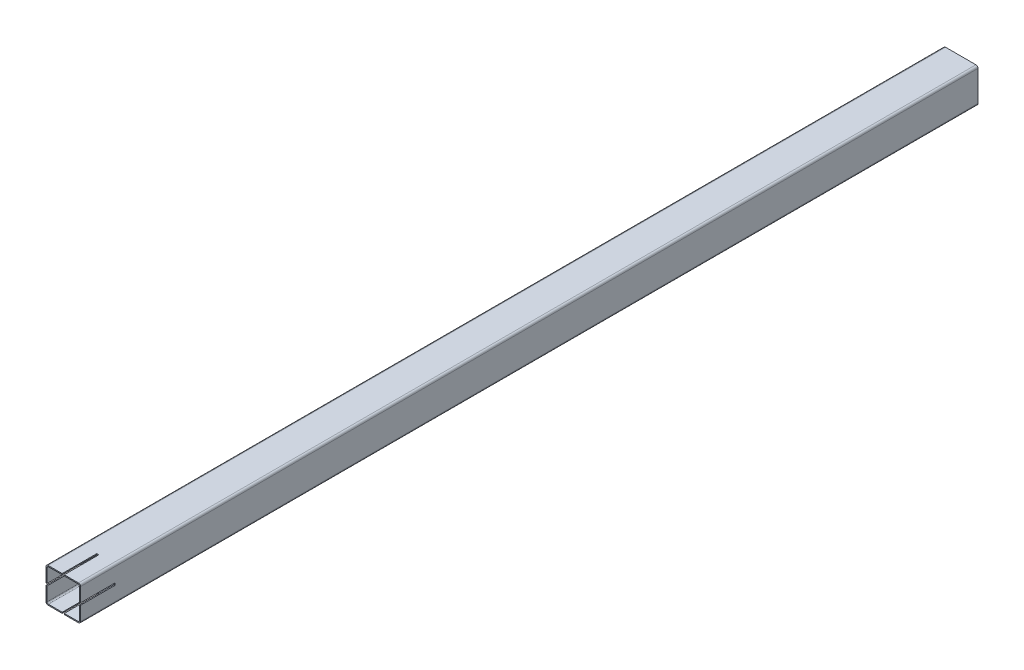
ISO-10303-21;
HEADER;
FILE_DESCRIPTION(('STEP AP214'),'2;1');
FILE_NAME('part.step','',(''),(''),'','','');
FILE_SCHEMA(('AUTOMOTIVE_DESIGN { 1 0 10303 214 1 1 1 1 }'));
ENDSEC;
DATA;
#1=APPLICATION_CONTEXT('core data for automotive mechanical design processes');
#2=APPLICATION_PROTOCOL_DEFINITION('international standard','automotive_design',2000,#1);
#3=PRODUCT_CONTEXT('',#1,'mechanical');
#4=PRODUCT('Part','Part','',(#3));
#5=PRODUCT_RELATED_PRODUCT_CATEGORY('part','',(#4));
#6=PRODUCT_DEFINITION_FORMATION('','',#4);
#7=PRODUCT_DEFINITION_CONTEXT('part definition',#1,'design');
#8=PRODUCT_DEFINITION('design','',#6,#7);
#9=PRODUCT_DEFINITION_SHAPE('','',#8);
#10=(LENGTH_UNIT() NAMED_UNIT(*) SI_UNIT(.MILLI.,.METRE.));
#11=(NAMED_UNIT(*) PLANE_ANGLE_UNIT() SI_UNIT($,.RADIAN.));
#12=(NAMED_UNIT(*) SI_UNIT($,.STERADIAN.) SOLID_ANGLE_UNIT());
#13=UNCERTAINTY_MEASURE_WITH_UNIT(LENGTH_MEASURE(1.E-05),#10,'distance_accuracy_value','');
#14=(GEOMETRIC_REPRESENTATION_CONTEXT(3) GLOBAL_UNCERTAINTY_ASSIGNED_CONTEXT((#13)) GLOBAL_UNIT_ASSIGNED_CONTEXT((#10,
#11,#12)) REPRESENTATION_CONTEXT('',''));
#15=CARTESIAN_POINT('',(0.,0.,0.));
#16=DIRECTION('',(0.,0.,1.));
#17=DIRECTION('',(1.,0.,0.));
#18=AXIS2_PLACEMENT_3D('',#15,#16,#17);
#19=CARTESIAN_POINT('',(-44.0000000000005,-43.9999999999965,0.));
#20=DIRECTION('',(0.,0.,1.));
#21=DIRECTION('',(1.,0.,0.));
#22=AXIS2_PLACEMENT_3D('',#19,#20,#21);
#23=PLANE('',#22);
#24=DIRECTION('',(-1.,0.,0.));
#25=VECTOR('',#24,1.);
#26=CARTESIAN_POINT('',(-50.0000000000007,3.,0.));
#27=LINE('',#26,#25);
#28=CARTESIAN_POINT('',(-47.0000000000009,3.,0.));
#29=VERTEX_POINT('',#28);
#30=CARTESIAN_POINT('',(-50.0000000000007,3.,0.));
#31=VERTEX_POINT('',#30);
#32=EDGE_CURVE('E259',#29,#31,#27,.T.);
#33=ORIENTED_EDGE('',*,*,#32,.F.);
#34=DIRECTION('',(0.,-1.,0.));
#35=VECTOR('',#34,1.);
#36=CARTESIAN_POINT('',(-47.0000000000009,43.0000000000035,0.));
#37=LINE('',#36,#35);
#38=CARTESIAN_POINT('',(-47.0000000000009,43.0000000000035,0.));
#39=VERTEX_POINT('',#38);
#40=EDGE_CURVE('E285',#39,#29,#37,.T.);
#41=ORIENTED_EDGE('',*,*,#40,.F.);
#42=CARTESIAN_POINT('',(-43.0000000000009,43.0000000000035,0.));
#43=DIRECTION('',(0.,0.,1.));
#44=DIRECTION('',(1.,0.,0.));
#45=AXIS2_PLACEMENT_3D('',#42,#43,#44);
#46=CIRCLE('',#45,4.);
#47=CARTESIAN_POINT('',(-43.0000000000009,47.0000000000035,0.));
#48=VERTEX_POINT('',#47);
#49=EDGE_CURVE('E326',#48,#39,#46,.T.);
#50=ORIENTED_EDGE('',*,*,#49,.F.);
#51=DIRECTION('',(-1.,0.,0.));
#52=VECTOR('',#51,1.);
#53=CARTESIAN_POINT('',(-43.0000000000009,47.0000000000035,0.));
#54=LINE('',#53,#52);
#55=CARTESIAN_POINT('',(-3.00000000000001,47.0000000000035,0.));
#56=VERTEX_POINT('',#55);
#57=EDGE_CURVE('E322',#56,#48,#54,.T.);
#58=ORIENTED_EDGE('',*,*,#57,.F.);
#59=DIRECTION('',(0.,-1.,0.));
#60=VECTOR('',#59,1.);
#61=CARTESIAN_POINT('',(-3.00000000000001,50.0000000000035,0.));
#62=LINE('',#61,#60);
#63=CARTESIAN_POINT('',(-3.00000000000001,50.0000000000035,0.));
#64=VERTEX_POINT('',#63);
#65=EDGE_CURVE('E472',#64,#56,#62,.T.);
#66=ORIENTED_EDGE('',*,*,#65,.F.);
#67=DIRECTION('',(-1.,0.,0.));
#68=VECTOR('',#67,1.);
#69=CARTESIAN_POINT('',(-44.0000000000005,50.0000000000035,0.));
#70=LINE('',#69,#68);
#71=CARTESIAN_POINT('',(-44.0000000000005,50.0000000000036,0.));
#72=VERTEX_POINT('',#71);
#73=EDGE_CURVE('E395',#64,#72,#70,.T.);
#74=ORIENTED_EDGE('',*,*,#73,.T.);
#75=CARTESIAN_POINT('',(-44.0000000000005,44.0000000000034,0.));
#76=DIRECTION('',(0.,0.,1.));
#77=DIRECTION('',(1.,0.,0.));
#78=AXIS2_PLACEMENT_3D('',#75,#76,#77);
#79=CIRCLE('',#78,6.00000000000014);
#80=CARTESIAN_POINT('',(-50.0000000000007,44.0000000000034,0.));
#81=VERTEX_POINT('',#80);
#82=EDGE_CURVE('E399',#72,#81,#79,.T.);
#83=ORIENTED_EDGE('',*,*,#82,.T.);
#84=DIRECTION('',(0.,-1.,0.));
#85=VECTOR('',#84,1.);
#86=CARTESIAN_POINT('',(-50.0000000000007,44.0000000000034,0.));
#87=LINE('',#86,#85);
#88=EDGE_CURVE('E357',#81,#31,#87,.T.);
#89=ORIENTED_EDGE('',*,*,#88,.T.);
#90=EDGE_LOOP('',(#33,#41,#50,#58,#66,#74,#83,#89));
#91=FACE_BOUND('',#90,.T.);
#92=ADVANCED_FACE('F36',(#91),#23,.T.);
#93=DIRECTION('',(0.,1.,0.));
#94=VECTOR('',#93,1.);
#95=CARTESIAN_POINT('',(3.00000000000001,50.0000000000035,0.));
#96=LINE('',#95,#94);
#97=CARTESIAN_POINT('',(3.00000000000001,47.0000000000035,0.));
#98=VERTEX_POINT('',#97);
#99=CARTESIAN_POINT('',(3.00000000000001,50.0000000000035,0.));
#100=VERTEX_POINT('',#99);
#101=EDGE_CURVE('E474',#98,#100,#96,.T.);
#102=ORIENTED_EDGE('',*,*,#101,.F.);
#103=CARTESIAN_POINT('',(42.9999999999991,47.0000000000035,0.));
#104=VERTEX_POINT('',#103);
#105=EDGE_CURVE('E323',#104,#98,#54,.T.);
#106=ORIENTED_EDGE('',*,*,#105,.F.);
#107=CARTESIAN_POINT('',(42.9999999999991,43.0000000000035,0.));
#108=DIRECTION('',(0.,0.,1.));
#109=DIRECTION('',(-1.,0.,0.));
#110=AXIS2_PLACEMENT_3D('',#107,#108,#109);
#111=CIRCLE('',#110,4.);
#112=CARTESIAN_POINT('',(46.9999999999991,43.0000000000035,0.));
#113=VERTEX_POINT('',#112);
#114=EDGE_CURVE('E319',#113,#104,#111,.T.);
#115=ORIENTED_EDGE('',*,*,#114,.F.);
#116=DIRECTION('',(0.,1.,0.));
#117=VECTOR('',#116,1.);
#118=CARTESIAN_POINT('',(46.9999999999991,43.0000000000035,0.));
#119=LINE('',#118,#117);
#120=CARTESIAN_POINT('',(46.9999999999991,3.,0.));
#121=VERTEX_POINT('',#120);
#122=EDGE_CURVE('E315',#121,#113,#119,.T.);
#123=ORIENTED_EDGE('',*,*,#122,.F.);
#124=DIRECTION('',(-1.,0.,0.));
#125=VECTOR('',#124,1.);
#126=CARTESIAN_POINT('',(3.,3.,0.));
#127=LINE('',#126,#125);
#128=CARTESIAN_POINT('',(49.9999999999989,3.,0.));
#129=VERTEX_POINT('',#128);
#130=EDGE_CURVE('E527',#129,#121,#127,.T.);
#131=ORIENTED_EDGE('',*,*,#130,.F.);
#132=DIRECTION('',(0.,1.,0.));
#133=VECTOR('',#132,1.);
#134=CARTESIAN_POINT('',(49.9999999999989,44.0000000000034,0.));
#135=LINE('',#134,#133);
#136=CARTESIAN_POINT('',(49.9999999999988,44.0000000000034,0.));
#137=VERTEX_POINT('',#136);
#138=EDGE_CURVE('E388',#129,#137,#135,.T.);
#139=ORIENTED_EDGE('',*,*,#138,.T.);
#140=CARTESIAN_POINT('',(43.9999999999987,44.0000000000034,0.));
#141=DIRECTION('',(0.,0.,1.));
#142=DIRECTION('',(-1.,0.,0.));
#143=AXIS2_PLACEMENT_3D('',#140,#141,#142);
#144=CIRCLE('',#143,6.00000000000014);
#145=CARTESIAN_POINT('',(43.9999999999987,50.0000000000035,0.));
#146=VERTEX_POINT('',#145);
#147=EDGE_CURVE('E392',#137,#146,#144,.T.);
#148=ORIENTED_EDGE('',*,*,#147,.T.);
#149=EDGE_CURVE('E396',#146,#100,#70,.T.);
#150=ORIENTED_EDGE('',*,*,#149,.T.);
#151=EDGE_LOOP('',(#102,#106,#115,#123,#131,#139,#148,#150));
#152=FACE_BOUND('',#151,.T.);
#153=ADVANCED_FACE('F544',(#152),#23,.T.);
#154=DIRECTION('',(1.,0.,0.));
#155=VECTOR('',#154,1.);
#156=CARTESIAN_POINT('',(3.,-3.,0.));
#157=LINE('',#156,#155);
#158=CARTESIAN_POINT('',(46.9999999999991,-3.,0.));
#159=VERTEX_POINT('',#158);
#160=CARTESIAN_POINT('',(49.9999999999989,-3.,0.));
#161=VERTEX_POINT('',#160);
#162=EDGE_CURVE('E504',#159,#161,#157,.T.);
#163=ORIENTED_EDGE('',*,*,#162,.F.);
#164=CARTESIAN_POINT('',(46.9999999999991,-42.9999999999966,0.));
#165=VERTEX_POINT('',#164);
#166=EDGE_CURVE('E316',#165,#159,#119,.T.);
#167=ORIENTED_EDGE('',*,*,#166,.F.);
#168=CARTESIAN_POINT('',(42.9999999999991,-42.9999999999966,0.));
#169=DIRECTION('',(0.,0.,1.));
#170=DIRECTION('',(1.,0.,0.));
#171=AXIS2_PLACEMENT_3D('',#168,#169,#170);
#172=CIRCLE('',#171,4.);
#173=CARTESIAN_POINT('',(42.9999999999991,-46.9999999999966,0.));
#174=VERTEX_POINT('',#173);
#175=EDGE_CURVE('E312',#174,#165,#172,.T.);
#176=ORIENTED_EDGE('',*,*,#175,.F.);
#177=DIRECTION('',(1.,0.,0.));
#178=VECTOR('',#177,1.);
#179=CARTESIAN_POINT('',(-43.0000000000009,-46.9999999999966,0.));
#180=LINE('',#179,#178);
#181=CARTESIAN_POINT('',(3.,-46.9999999999966,0.));
#182=VERTEX_POINT('',#181);
#183=EDGE_CURVE('E308',#182,#174,#180,.T.);
#184=ORIENTED_EDGE('',*,*,#183,.F.);
#185=DIRECTION('',(0.,1.,0.));
#186=VECTOR('',#185,1.);
#187=CARTESIAN_POINT('',(3.,-3.,0.));
#188=LINE('',#187,#186);
#189=CARTESIAN_POINT('',(3.,-49.9999999999966,0.));
#190=VERTEX_POINT('',#189);
#191=EDGE_CURVE('E493',#190,#182,#188,.T.);
#192=ORIENTED_EDGE('',*,*,#191,.F.);
#193=DIRECTION('',(1.,0.,0.));
#194=VECTOR('',#193,1.);
#195=CARTESIAN_POINT('',(-44.0000000000005,-49.9999999999966,0.));
#196=LINE('',#195,#194);
#197=CARTESIAN_POINT('',(43.9999999999987,-49.9999999999967,0.));
#198=VERTEX_POINT('',#197);
#199=EDGE_CURVE('E381',#190,#198,#196,.T.);
#200=ORIENTED_EDGE('',*,*,#199,.T.);
#201=CARTESIAN_POINT('',(43.9999999999987,-43.9999999999965,0.));
#202=DIRECTION('',(0.,0.,1.));
#203=DIRECTION('',(1.,0.,0.));
#204=AXIS2_PLACEMENT_3D('',#201,#202,#203);
#205=CIRCLE('',#204,6.00000000000014);
#206=CARTESIAN_POINT('',(49.9999999999989,-43.9999999999965,0.));
#207=VERTEX_POINT('',#206);
#208=EDGE_CURVE('E385',#198,#207,#205,.T.);
#209=ORIENTED_EDGE('',*,*,#208,.T.);
#210=EDGE_CURVE('E389',#207,#161,#135,.T.);
#211=ORIENTED_EDGE('',*,*,#210,.T.);
#212=EDGE_LOOP('',(#163,#167,#176,#184,#192,#200,#209,#211));
#213=FACE_BOUND('',#212,.T.);
#214=ADVANCED_FACE('F502',(#213),#23,.T.);
#215=CARTESIAN_POINT('',(-44.0000000000005,-43.9999999999965,-2600.));
#216=DIRECTION('',(0.,0.,1.));
#217=DIRECTION('',(1.,0.,0.));
#218=AXIS2_PLACEMENT_3D('',#215,#216,#217);
#219=CYLINDRICAL_SURFACE('',#218,6.00000000000014);
#220=CARTESIAN_POINT('',(-44.0000000000005,-43.9999999999965,0.));
#221=DIRECTION('',(0.,0.,1.));
#222=DIRECTION('',(1.,0.,0.));
#223=AXIS2_PLACEMENT_3D('',#220,#221,#222);
#224=CIRCLE('',#223,6.00000000000014);
#225=CARTESIAN_POINT('',(-50.0000000000007,-43.9999999999965,0.));
#226=VERTEX_POINT('',#225);
#227=CARTESIAN_POINT('',(-44.0000000000005,-49.9999999999966,0.));
#228=VERTEX_POINT('',#227);
#229=EDGE_CURVE('E335',#226,#228,#224,.T.);
#230=ORIENTED_EDGE('',*,*,#229,.F.);
#231=DIRECTION('',(0.,0.,1.));
#232=VECTOR('',#231,1.);
#233=CARTESIAN_POINT('',(-50.0000000000007,-43.9999999999965,-2600.));
#234=LINE('',#233,#232);
#235=CARTESIAN_POINT('',(-50.0000000000007,-43.9999999999965,-2600.));
#236=VERTEX_POINT('',#235);
#237=EDGE_CURVE('E404',#236,#226,#234,.T.);
#238=ORIENTED_EDGE('',*,*,#237,.F.);
#239=CARTESIAN_POINT('',(-44.0000000000005,-43.9999999999965,-2600.));
#240=DIRECTION('',(0.,0.,1.));
#241=DIRECTION('',(1.,0.,0.));
#242=AXIS2_PLACEMENT_3D('',#239,#240,#241);
#243=CIRCLE('',#242,6.00000000000014);
#244=CARTESIAN_POINT('',(-44.0000000000005,-49.9999999999966,-2600.));
#245=VERTEX_POINT('',#244);
#246=EDGE_CURVE('E353',#236,#245,#243,.T.);
#247=ORIENTED_EDGE('',*,*,#246,.T.);
#248=DIRECTION('',(0.,0.,1.));
#249=VECTOR('',#248,1.);
#250=CARTESIAN_POINT('',(-44.0000000000005,-49.9999999999966,-2600.));
#251=LINE('',#250,#249);
#252=EDGE_CURVE('E378',#245,#228,#251,.T.);
#253=ORIENTED_EDGE('',*,*,#252,.T.);
#254=EDGE_LOOP('',(#230,#238,#247,#253));
#255=FACE_BOUND('',#254,.T.);
#256=ADVANCED_FACE('F38',(#255),#219,.T.);
#257=CARTESIAN_POINT('',(-50.0000000000007,44.0000000000034,-2600.));
#258=DIRECTION('',(-1.,0.,0.));
#259=DIRECTION('',(0.,0.,1.));
#260=AXIS2_PLACEMENT_3D('',#257,#258,#259);
#261=PLANE('',#260);
#262=DIRECTION('',(0.,0.,1.));
#263=VECTOR('',#262,1.);
#264=CARTESIAN_POINT('',(-50.0000000000007,3.,-100.));
#265=LINE('',#264,#263);
#266=CARTESIAN_POINT('',(-50.0000000000007,3.,-100.));
#267=VERTEX_POINT('',#266);
#268=EDGE_CURVE('E276',#267,#31,#265,.T.);
#269=ORIENTED_EDGE('',*,*,#268,.T.);
#270=ORIENTED_EDGE('',*,*,#88,.F.);
#271=DIRECTION('',(0.,0.,1.));
#272=VECTOR('',#271,1.);
#273=CARTESIAN_POINT('',(-50.0000000000007,44.0000000000034,-2600.));
#274=LINE('',#273,#272);
#275=CARTESIAN_POINT('',(-50.0000000000007,44.0000000000034,-2600.));
#276=VERTEX_POINT('',#275);
#277=EDGE_CURVE('E407',#276,#81,#274,.T.);
#278=ORIENTED_EDGE('',*,*,#277,.F.);
#279=DIRECTION('',(0.,-1.,0.));
#280=VECTOR('',#279,1.);
#281=CARTESIAN_POINT('',(-50.0000000000007,44.0000000000034,-2600.));
#282=LINE('',#281,#280);
#283=EDGE_CURVE('E375',#276,#236,#282,.T.);
#284=ORIENTED_EDGE('',*,*,#283,.T.);
#285=ORIENTED_EDGE('',*,*,#237,.T.);
#286=CARTESIAN_POINT('',(-50.0000000000007,-3.,0.));
#287=VERTEX_POINT('',#286);
#288=EDGE_CURVE('E264',#287,#226,#87,.T.);
#289=ORIENTED_EDGE('',*,*,#288,.F.);
#290=DIRECTION('',(0.,0.,1.));
#291=VECTOR('',#290,1.);
#292=CARTESIAN_POINT('',(-50.0000000000007,-3.,-100.));
#293=LINE('',#292,#291);
#294=CARTESIAN_POINT('',(-50.0000000000007,-3.,-100.));
#295=VERTEX_POINT('',#294);
#296=EDGE_CURVE('E245',#295,#287,#293,.T.);
#297=ORIENTED_EDGE('',*,*,#296,.F.);
#298=DIRECTION('',(0.,-1.,0.));
#299=VECTOR('',#298,1.);
#300=CARTESIAN_POINT('',(-50.0000000000007,3.,-100.));
#301=LINE('',#300,#299);
#302=EDGE_CURVE('E250',#267,#295,#301,.T.);
#303=ORIENTED_EDGE('',*,*,#302,.F.);
#304=EDGE_LOOP('',(#269,#270,#278,#284,#285,#289,#297,#303));
#305=FACE_BOUND('',#304,.T.);
#306=ADVANCED_FACE('F262',(#305),#261,.T.);
#307=CARTESIAN_POINT('',(-44.0000000000005,44.0000000000034,-2600.));
#308=DIRECTION('',(0.,0.,1.));
#309=DIRECTION('',(1.,0.,0.));
#310=AXIS2_PLACEMENT_3D('',#307,#308,#309);
#311=CYLINDRICAL_SURFACE('',#310,6.00000000000014);
#312=ORIENTED_EDGE('',*,*,#82,.F.);
#313=DIRECTION('',(0.,0.,1.));
#314=VECTOR('',#313,1.);
#315=CARTESIAN_POINT('',(-44.0000000000005,50.0000000000036,-2600.));
#316=LINE('',#315,#314);
#317=CARTESIAN_POINT('',(-44.0000000000005,50.0000000000036,-2600.));
#318=VERTEX_POINT('',#317);
#319=EDGE_CURVE('E409',#318,#72,#316,.T.);
#320=ORIENTED_EDGE('',*,*,#319,.F.);
#321=CARTESIAN_POINT('',(-44.0000000000005,44.0000000000034,-2600.));
#322=DIRECTION('',(0.,0.,1.));
#323=DIRECTION('',(1.,0.,0.));
#324=AXIS2_PLACEMENT_3D('',#321,#322,#323);
#325=CIRCLE('',#324,6.00000000000014);
#326=EDGE_CURVE('E372',#318,#276,#325,.T.);
#327=ORIENTED_EDGE('',*,*,#326,.T.);
#328=ORIENTED_EDGE('',*,*,#277,.T.);
#329=EDGE_LOOP('',(#312,#320,#327,#328));
#330=FACE_BOUND('',#329,.T.);
#331=ADVANCED_FACE('F557',(#330),#311,.T.);
#332=CARTESIAN_POINT('',(-44.0000000000005,50.0000000000035,-2600.));
#333=DIRECTION('',(0.,1.,0.));
#334=DIRECTION('',(0.,0.,1.));
#335=AXIS2_PLACEMENT_3D('',#332,#333,#334);
#336=PLANE('',#335);
#337=DIRECTION('',(0.,0.,1.));
#338=VECTOR('',#337,1.);
#339=CARTESIAN_POINT('',(-3.00000000000001,50.0000000000035,-100.));
#340=LINE('',#339,#338);
#341=CARTESIAN_POINT('',(-3.00000000000001,50.0000000000035,-100.));
#342=VERTEX_POINT('',#341);
#343=EDGE_CURVE('E479',#342,#64,#340,.T.);
#344=ORIENTED_EDGE('',*,*,#343,.F.);
#345=DIRECTION('',(-1.,0.,0.));
#346=VECTOR('',#345,1.);
#347=CARTESIAN_POINT('',(-3.00000000000001,50.0000000000035,-100.));
#348=LINE('',#347,#346);
#349=CARTESIAN_POINT('',(3.00000000000001,50.0000000000035,-100.));
#350=VERTEX_POINT('',#349);
#351=EDGE_CURVE('E543',#350,#342,#348,.T.);
#352=ORIENTED_EDGE('',*,*,#351,.F.);
#353=DIRECTION('',(0.,0.,1.));
#354=VECTOR('',#353,1.);
#355=CARTESIAN_POINT('',(3.00000000000001,50.0000000000035,-100.));
#356=LINE('',#355,#354);
#357=EDGE_CURVE('E481',#350,#100,#356,.T.);
#358=ORIENTED_EDGE('',*,*,#357,.T.);
#359=ORIENTED_EDGE('',*,*,#149,.F.);
#360=DIRECTION('',(0.,0.,1.));
#361=VECTOR('',#360,1.);
#362=CARTESIAN_POINT('',(43.9999999999987,50.0000000000035,-2600.));
#363=LINE('',#362,#361);
#364=CARTESIAN_POINT('',(43.9999999999987,50.0000000000035,-2600.));
#365=VERTEX_POINT('',#364);
#366=EDGE_CURVE('E412',#365,#146,#363,.T.);
#367=ORIENTED_EDGE('',*,*,#366,.F.);
#368=DIRECTION('',(-1.,0.,0.));
#369=VECTOR('',#368,1.);
#370=CARTESIAN_POINT('',(-44.0000000000005,50.0000000000035,-2600.));
#371=LINE('',#370,#369);
#372=EDGE_CURVE('E369',#365,#318,#371,.T.);
#373=ORIENTED_EDGE('',*,*,#372,.T.);
#374=ORIENTED_EDGE('',*,*,#319,.T.);
#375=ORIENTED_EDGE('',*,*,#73,.F.);
#376=EDGE_LOOP('',(#344,#352,#358,#359,#367,#373,#374,#375));
#377=FACE_BOUND('',#376,.T.);
#378=ADVANCED_FACE('F542',(#377),#336,.T.);
#379=CARTESIAN_POINT('',(43.9999999999987,44.0000000000034,-2600.));
#380=DIRECTION('',(0.,0.,1.));
#381=DIRECTION('',(1.,0.,0.));
#382=AXIS2_PLACEMENT_3D('',#379,#380,#381);
#383=CYLINDRICAL_SURFACE('',#382,6.00000000000014);
#384=ORIENTED_EDGE('',*,*,#147,.F.);
#385=DIRECTION('',(0.,0.,1.));
#386=VECTOR('',#385,1.);
#387=CARTESIAN_POINT('',(49.9999999999988,44.0000000000034,-2600.));
#388=LINE('',#387,#386);
#389=CARTESIAN_POINT('',(49.9999999999988,44.0000000000034,-2600.));
#390=VERTEX_POINT('',#389);
#391=EDGE_CURVE('E414',#390,#137,#388,.T.);
#392=ORIENTED_EDGE('',*,*,#391,.F.);
#393=CARTESIAN_POINT('',(43.9999999999987,44.0000000000034,-2600.));
#394=DIRECTION('',(0.,0.,1.));
#395=DIRECTION('',(-1.,0.,0.));
#396=AXIS2_PLACEMENT_3D('',#393,#394,#395);
#397=CIRCLE('',#396,6.00000000000014);
#398=EDGE_CURVE('E366',#390,#365,#397,.T.);
#399=ORIENTED_EDGE('',*,*,#398,.T.);
#400=ORIENTED_EDGE('',*,*,#366,.T.);
#401=EDGE_LOOP('',(#384,#392,#399,#400));
#402=FACE_BOUND('',#401,.T.);
#403=ADVANCED_FACE('F549',(#402),#383,.T.);
#404=CARTESIAN_POINT('',(49.9999999999989,44.0000000000034,-2600.));
#405=DIRECTION('',(1.,0.,0.));
#406=DIRECTION('',(0.,0.,-1.));
#407=AXIS2_PLACEMENT_3D('',#404,#405,#406);
#408=PLANE('',#407);
#409=DIRECTION('',(0.,0.,1.));
#410=VECTOR('',#409,1.);
#411=CARTESIAN_POINT('',(49.9999999999989,3.,-100.));
#412=LINE('',#411,#410);
#413=CARTESIAN_POINT('',(49.9999999999989,3.,-100.));
#414=VERTEX_POINT('',#413);
#415=EDGE_CURVE('E484',#414,#129,#412,.T.);
#416=ORIENTED_EDGE('',*,*,#415,.F.);
#417=DIRECTION('',(0.,1.,0.));
#418=VECTOR('',#417,1.);
#419=CARTESIAN_POINT('',(49.9999999999989,3.,-100.));
#420=LINE('',#419,#418);
#421=CARTESIAN_POINT('',(49.9999999999989,-3.,-100.));
#422=VERTEX_POINT('',#421);
#423=EDGE_CURVE('E522',#422,#414,#420,.T.);
#424=ORIENTED_EDGE('',*,*,#423,.F.);
#425=DIRECTION('',(0.,0.,1.));
#426=VECTOR('',#425,1.);
#427=CARTESIAN_POINT('',(49.9999999999989,-3.,-100.));
#428=LINE('',#427,#426);
#429=EDGE_CURVE('E486',#422,#161,#428,.T.);
#430=ORIENTED_EDGE('',*,*,#429,.T.);
#431=ORIENTED_EDGE('',*,*,#210,.F.);
#432=DIRECTION('',(0.,0.,1.));
#433=VECTOR('',#432,1.);
#434=CARTESIAN_POINT('',(49.9999999999989,-43.9999999999965,-2600.));
#435=LINE('',#434,#433);
#436=CARTESIAN_POINT('',(49.9999999999989,-43.9999999999965,-2600.));
#437=VERTEX_POINT('',#436);
#438=EDGE_CURVE('E417',#437,#207,#435,.T.);
#439=ORIENTED_EDGE('',*,*,#438,.F.);
#440=DIRECTION('',(0.,1.,0.));
#441=VECTOR('',#440,1.);
#442=CARTESIAN_POINT('',(49.9999999999989,44.0000000000034,-2600.));
#443=LINE('',#442,#441);
#444=EDGE_CURVE('E363',#437,#390,#443,.T.);
#445=ORIENTED_EDGE('',*,*,#444,.T.);
#446=ORIENTED_EDGE('',*,*,#391,.T.);
#447=ORIENTED_EDGE('',*,*,#138,.F.);
#448=EDGE_LOOP('',(#416,#424,#430,#431,#439,#445,#446,#447));
#449=FACE_BOUND('',#448,.T.);
#450=ADVANCED_FACE('F517',(#449),#408,.T.);
#451=CARTESIAN_POINT('',(43.9999999999987,-43.9999999999965,-2600.));
#452=DIRECTION('',(0.,0.,1.));
#453=DIRECTION('',(1.,0.,0.));
#454=AXIS2_PLACEMENT_3D('',#451,#452,#453);
#455=CYLINDRICAL_SURFACE('',#454,6.00000000000014);
#456=ORIENTED_EDGE('',*,*,#208,.F.);
#457=DIRECTION('',(0.,0.,1.));
#458=VECTOR('',#457,1.);
#459=CARTESIAN_POINT('',(43.9999999999987,-49.9999999999967,-2600.));
#460=LINE('',#459,#458);
#461=CARTESIAN_POINT('',(43.9999999999987,-49.9999999999967,-2600.));
#462=VERTEX_POINT('',#461);
#463=EDGE_CURVE('E419',#462,#198,#460,.T.);
#464=ORIENTED_EDGE('',*,*,#463,.F.);
#465=CARTESIAN_POINT('',(43.9999999999987,-43.9999999999965,-2600.));
#466=DIRECTION('',(0.,0.,1.));
#467=DIRECTION('',(1.,0.,0.));
#468=AXIS2_PLACEMENT_3D('',#465,#466,#467);
#469=CIRCLE('',#468,6.00000000000014);
#470=EDGE_CURVE('E360',#462,#437,#469,.T.);
#471=ORIENTED_EDGE('',*,*,#470,.T.);
#472=ORIENTED_EDGE('',*,*,#438,.T.);
#473=EDGE_LOOP('',(#456,#464,#471,#472));
#474=FACE_BOUND('',#473,.T.);
#475=ADVANCED_FACE('F512',(#474),#455,.T.);
#476=CARTESIAN_POINT('',(-44.0000000000005,-49.9999999999966,-2600.));
#477=DIRECTION('',(0.,-1.,0.));
#478=DIRECTION('',(0.,0.,-1.));
#479=AXIS2_PLACEMENT_3D('',#476,#477,#478);
#480=PLANE('',#479);
#481=DIRECTION('',(0.,0.,1.));
#482=VECTOR('',#481,1.);
#483=CARTESIAN_POINT('',(3.,-49.9999999999966,-100.));
#484=LINE('',#483,#482);
#485=CARTESIAN_POINT('',(3.,-49.9999999999966,-100.));
#486=VERTEX_POINT('',#485);
#487=EDGE_CURVE('E268',#486,#190,#484,.T.);
#488=ORIENTED_EDGE('',*,*,#487,.F.);
#489=DIRECTION('',(1.,0.,0.));
#490=VECTOR('',#489,1.);
#491=CARTESIAN_POINT('',(-3.,-49.9999999999966,-100.));
#492=LINE('',#491,#490);
#493=CARTESIAN_POINT('',(-3.,-49.9999999999966,-100.));
#494=VERTEX_POINT('',#493);
#495=EDGE_CURVE('E579',#494,#486,#492,.T.);
#496=ORIENTED_EDGE('',*,*,#495,.F.);
#497=DIRECTION('',(0.,0.,1.));
#498=VECTOR('',#497,1.);
#499=CARTESIAN_POINT('',(-3.,-49.9999999999966,-100.));
#500=LINE('',#499,#498);
#501=CARTESIAN_POINT('',(-3.,-49.9999999999966,0.));
#502=VERTEX_POINT('',#501);
#503=EDGE_CURVE('E265',#494,#502,#500,.T.);
#504=ORIENTED_EDGE('',*,*,#503,.T.);
#505=EDGE_CURVE('E382',#228,#502,#196,.T.);
#506=ORIENTED_EDGE('',*,*,#505,.F.);
#507=ORIENTED_EDGE('',*,*,#252,.F.);
#508=DIRECTION('',(1.,0.,0.));
#509=VECTOR('',#508,1.);
#510=CARTESIAN_POINT('',(-44.0000000000005,-49.9999999999966,-2600.));
#511=LINE('',#510,#509);
#512=EDGE_CURVE('E356',#245,#462,#511,.T.);
#513=ORIENTED_EDGE('',*,*,#512,.T.);
#514=ORIENTED_EDGE('',*,*,#463,.T.);
#515=ORIENTED_EDGE('',*,*,#199,.F.);
#516=EDGE_LOOP('',(#488,#496,#504,#506,#507,#513,#514,#515));
#517=FACE_BOUND('',#516,.T.);
#518=ADVANCED_FACE('F507',(#517),#480,.T.);
#519=CARTESIAN_POINT('',(-44.0000000000005,-43.9999999999965,-2600.));
#520=DIRECTION('',(0.,0.,1.));
#521=DIRECTION('',(1.,0.,0.));
#522=AXIS2_PLACEMENT_3D('',#519,#520,#521);
#523=PLANE('',#522);
#524=DIRECTION('',(0.,-1.,0.));
#525=VECTOR('',#524,1.);
#526=CARTESIAN_POINT('',(-47.0000000000009,43.0000000000035,-2600.));
#527=LINE('',#526,#525);
#528=CARTESIAN_POINT('',(-47.0000000000009,43.0000000000035,-2600.));
#529=VERTEX_POINT('',#528);
#530=CARTESIAN_POINT('',(-47.0000000000009,-42.9999999999966,-2600.));
#531=VERTEX_POINT('',#530);
#532=EDGE_CURVE('E303',#529,#531,#527,.T.);
#533=ORIENTED_EDGE('',*,*,#532,.T.);
#534=CARTESIAN_POINT('',(-43.0000000000009,-42.9999999999966,-2600.));
#535=DIRECTION('',(0.,0.,1.));
#536=DIRECTION('',(1.,0.,0.));
#537=AXIS2_PLACEMENT_3D('',#534,#535,#536);
#538=CIRCLE('',#537,4.);
#539=CARTESIAN_POINT('',(-43.0000000000009,-46.9999999999966,-2600.));
#540=VERTEX_POINT('',#539);
#541=EDGE_CURVE('E281',#531,#540,#538,.T.);
#542=ORIENTED_EDGE('',*,*,#541,.T.);
#543=DIRECTION('',(1.,0.,0.));
#544=VECTOR('',#543,1.);
#545=CARTESIAN_POINT('',(-43.0000000000009,-46.9999999999966,-2600.));
#546=LINE('',#545,#544);
#547=CARTESIAN_POINT('',(42.9999999999991,-46.9999999999966,-2600.));
#548=VERTEX_POINT('',#547);
#549=EDGE_CURVE('E284',#540,#548,#546,.T.);
#550=ORIENTED_EDGE('',*,*,#549,.T.);
#551=CARTESIAN_POINT('',(42.9999999999991,-42.9999999999966,-2600.));
#552=DIRECTION('',(0.,0.,1.));
#553=DIRECTION('',(1.,0.,0.));
#554=AXIS2_PLACEMENT_3D('',#551,#552,#553);
#555=CIRCLE('',#554,4.);
#556=CARTESIAN_POINT('',(46.9999999999991,-42.9999999999966,-2600.));
#557=VERTEX_POINT('',#556);
#558=EDGE_CURVE('E288',#548,#557,#555,.T.);
#559=ORIENTED_EDGE('',*,*,#558,.T.);
#560=DIRECTION('',(0.,1.,0.));
#561=VECTOR('',#560,1.);
#562=CARTESIAN_POINT('',(46.9999999999991,43.0000000000035,-2600.));
#563=LINE('',#562,#561);
#564=CARTESIAN_POINT('',(46.9999999999991,43.0000000000035,-2600.));
#565=VERTEX_POINT('',#564);
#566=EDGE_CURVE('E291',#557,#565,#563,.T.);
#567=ORIENTED_EDGE('',*,*,#566,.T.);
#568=CARTESIAN_POINT('',(42.9999999999991,43.0000000000035,-2600.));
#569=DIRECTION('',(0.,0.,1.));
#570=DIRECTION('',(-1.,0.,0.));
#571=AXIS2_PLACEMENT_3D('',#568,#569,#570);
#572=CIRCLE('',#571,4.);
#573=CARTESIAN_POINT('',(42.9999999999991,47.0000000000035,-2600.));
#574=VERTEX_POINT('',#573);
#575=EDGE_CURVE('E294',#565,#574,#572,.T.);
#576=ORIENTED_EDGE('',*,*,#575,.T.);
#577=DIRECTION('',(-1.,0.,0.));
#578=VECTOR('',#577,1.);
#579=CARTESIAN_POINT('',(-43.0000000000009,47.0000000000035,-2600.));
#580=LINE('',#579,#578);
#581=CARTESIAN_POINT('',(-43.0000000000009,47.0000000000035,-2600.));
#582=VERTEX_POINT('',#581);
#583=EDGE_CURVE('E297',#574,#582,#580,.T.);
#584=ORIENTED_EDGE('',*,*,#583,.T.);
#585=CARTESIAN_POINT('',(-43.0000000000009,43.0000000000035,-2600.));
#586=DIRECTION('',(0.,0.,1.));
#587=DIRECTION('',(1.,0.,0.));
#588=AXIS2_PLACEMENT_3D('',#585,#586,#587);
#589=CIRCLE('',#588,4.);
#590=EDGE_CURVE('E300',#582,#529,#589,.T.);
#591=ORIENTED_EDGE('',*,*,#590,.T.);
#592=EDGE_LOOP('',(#533,#542,#550,#559,#567,#576,#584,#591));
#593=FACE_BOUND('',#592,.T.);
#594=ORIENTED_EDGE('',*,*,#246,.F.);
#595=ORIENTED_EDGE('',*,*,#283,.F.);
#596=ORIENTED_EDGE('',*,*,#326,.F.);
#597=ORIENTED_EDGE('',*,*,#372,.F.);
#598=ORIENTED_EDGE('',*,*,#398,.F.);
#599=ORIENTED_EDGE('',*,*,#444,.F.);
#600=ORIENTED_EDGE('',*,*,#470,.F.);
#601=ORIENTED_EDGE('',*,*,#512,.F.);
#602=EDGE_LOOP('',(#594,#595,#596,#597,#598,#599,#600,#601));
#603=FACE_BOUND('',#602,.T.);
#604=ADVANCED_FACE('F459',(#593,#603),#523,.F.);
#605=DIRECTION('',(0.,-1.,0.));
#606=VECTOR('',#605,1.);
#607=CARTESIAN_POINT('',(-3.,-3.,0.));
#608=LINE('',#607,#606);
#609=CARTESIAN_POINT('',(-3.,-46.9999999999966,0.));
#610=VERTEX_POINT('',#609);
#611=EDGE_CURVE('E505',#610,#502,#608,.T.);
#612=ORIENTED_EDGE('',*,*,#611,.F.);
#613=CARTESIAN_POINT('',(-43.0000000000009,-46.9999999999966,0.));
#614=VERTEX_POINT('',#613);
#615=EDGE_CURVE('E309',#614,#610,#180,.T.);
#616=ORIENTED_EDGE('',*,*,#615,.F.);
#617=CARTESIAN_POINT('',(-43.0000000000009,-42.9999999999966,0.));
#618=DIRECTION('',(0.,0.,1.));
#619=DIRECTION('',(1.,0.,0.));
#620=AXIS2_PLACEMENT_3D('',#617,#618,#619);
#621=CIRCLE('',#620,4.);
#622=CARTESIAN_POINT('',(-47.0000000000009,-42.9999999999966,0.));
#623=VERTEX_POINT('',#622);
#624=EDGE_CURVE('E280',#623,#614,#621,.T.);
#625=ORIENTED_EDGE('',*,*,#624,.F.);
#626=CARTESIAN_POINT('',(-47.0000000000009,-3.,0.));
#627=VERTEX_POINT('',#626);
#628=EDGE_CURVE('E329',#627,#623,#37,.T.);
#629=ORIENTED_EDGE('',*,*,#628,.F.);
#630=DIRECTION('',(1.,0.,0.));
#631=VECTOR('',#630,1.);
#632=CARTESIAN_POINT('',(-50.0000000000007,-3.,0.));
#633=LINE('',#632,#631);
#634=EDGE_CURVE('E448',#287,#627,#633,.T.);
#635=ORIENTED_EDGE('',*,*,#634,.F.);
#636=ORIENTED_EDGE('',*,*,#288,.T.);
#637=ORIENTED_EDGE('',*,*,#229,.T.);
#638=ORIENTED_EDGE('',*,*,#505,.T.);
#639=EDGE_LOOP('',(#612,#616,#625,#629,#635,#636,#637,#638));
#640=FACE_BOUND('',#639,.T.);
#641=ADVANCED_FACE('F447',(#640),#23,.T.);
#642=CARTESIAN_POINT('',(-43.0000000000009,-42.9999999999966,-2600.));
#643=DIRECTION('',(0.,0.,1.));
#644=DIRECTION('',(1.,0.,0.));
#645=AXIS2_PLACEMENT_3D('',#642,#643,#644);
#646=CYLINDRICAL_SURFACE('',#645,4.);
#647=ORIENTED_EDGE('',*,*,#624,.T.);
#648=DIRECTION('',(0.,0.,1.));
#649=VECTOR('',#648,1.);
#650=CARTESIAN_POINT('',(-43.0000000000009,-46.9999999999966,-2600.));
#651=LINE('',#650,#649);
#652=EDGE_CURVE('E306',#540,#614,#651,.T.);
#653=ORIENTED_EDGE('',*,*,#652,.F.);
#654=ORIENTED_EDGE('',*,*,#541,.F.);
#655=DIRECTION('',(0.,0.,1.));
#656=VECTOR('',#655,1.);
#657=CARTESIAN_POINT('',(-47.0000000000009,-42.9999999999966,-2600.));
#658=LINE('',#657,#656);
#659=EDGE_CURVE('E332',#531,#623,#658,.T.);
#660=ORIENTED_EDGE('',*,*,#659,.T.);
#661=EDGE_LOOP('',(#647,#653,#654,#660));
#662=FACE_BOUND('',#661,.T.);
#663=ADVANCED_FACE('F451',(#662),#646,.F.);
#664=CARTESIAN_POINT('',(-47.0000000000009,43.0000000000035,-2600.));
#665=DIRECTION('',(-1.,0.,0.));
#666=DIRECTION('',(0.,0.,1.));
#667=AXIS2_PLACEMENT_3D('',#664,#665,#666);
#668=PLANE('',#667);
#669=ORIENTED_EDGE('',*,*,#40,.T.);
#670=DIRECTION('',(0.,0.,-1.));
#671=VECTOR('',#670,1.);
#672=CARTESIAN_POINT('',(-47.0000000000009,3.,-2600.));
#673=LINE('',#672,#671);
#674=CARTESIAN_POINT('',(-47.0000000000009,3.,-100.));
#675=VERTEX_POINT('',#674);
#676=EDGE_CURVE('E11',#29,#675,#673,.T.);
#677=ORIENTED_EDGE('',*,*,#676,.T.);
#678=DIRECTION('',(0.,1.,0.));
#679=VECTOR('',#678,1.);
#680=CARTESIAN_POINT('',(-47.0000000000009,43.0000000000035,-100.));
#681=LINE('',#680,#679);
#682=CARTESIAN_POINT('',(-47.0000000000009,-3.,-100.));
#683=VERTEX_POINT('',#682);
#684=EDGE_CURVE('E278',#683,#675,#681,.T.);
#685=ORIENTED_EDGE('',*,*,#684,.F.);
#686=DIRECTION('',(0.,0.,1.));
#687=VECTOR('',#686,1.);
#688=CARTESIAN_POINT('',(-47.0000000000009,-3.,-2600.));
#689=LINE('',#688,#687);
#690=EDGE_CURVE('E44',#683,#627,#689,.T.);
#691=ORIENTED_EDGE('',*,*,#690,.T.);
#692=ORIENTED_EDGE('',*,*,#628,.T.);
#693=ORIENTED_EDGE('',*,*,#659,.F.);
#694=ORIENTED_EDGE('',*,*,#532,.F.);
#695=DIRECTION('',(0.,0.,1.));
#696=VECTOR('',#695,1.);
#697=CARTESIAN_POINT('',(-47.0000000000009,43.0000000000035,-2600.));
#698=LINE('',#697,#696);
#699=EDGE_CURVE('E336',#529,#39,#698,.T.);
#700=ORIENTED_EDGE('',*,*,#699,.T.);
#701=EDGE_LOOP('',(#669,#677,#685,#691,#692,#693,#694,#700));
#702=FACE_BOUND('',#701,.T.);
#703=ADVANCED_FACE('F443',(#702),#668,.F.);
#704=CARTESIAN_POINT('',(-43.0000000000009,43.0000000000035,-2600.));
#705=DIRECTION('',(0.,0.,1.));
#706=DIRECTION('',(1.,0.,0.));
#707=AXIS2_PLACEMENT_3D('',#704,#705,#706);
#708=CYLINDRICAL_SURFACE('',#707,4.);
#709=ORIENTED_EDGE('',*,*,#49,.T.);
#710=ORIENTED_EDGE('',*,*,#699,.F.);
#711=ORIENTED_EDGE('',*,*,#590,.F.);
#712=DIRECTION('',(0.,0.,1.));
#713=VECTOR('',#712,1.);
#714=CARTESIAN_POINT('',(-43.0000000000009,47.0000000000035,-2600.));
#715=LINE('',#714,#713);
#716=EDGE_CURVE('E338',#582,#48,#715,.T.);
#717=ORIENTED_EDGE('',*,*,#716,.T.);
#718=EDGE_LOOP('',(#709,#710,#711,#717));
#719=FACE_BOUND('',#718,.T.);
#720=ADVANCED_FACE('F466',(#719),#708,.F.);
#721=CARTESIAN_POINT('',(-43.0000000000009,47.0000000000035,-2600.));
#722=DIRECTION('',(0.,1.,0.));
#723=DIRECTION('',(0.,0.,1.));
#724=AXIS2_PLACEMENT_3D('',#721,#722,#723);
#725=PLANE('',#724);
#726=DIRECTION('',(1.,0.,0.));
#727=VECTOR('',#726,1.);
#728=CARTESIAN_POINT('',(-43.0000000000009,47.0000000000035,-100.));
#729=LINE('',#728,#727);
#730=CARTESIAN_POINT('',(-3.00000000000001,47.0000000000035,-100.));
#731=VERTEX_POINT('',#730);
#732=CARTESIAN_POINT('',(3.00000000000001,47.0000000000035,-100.));
#733=VERTEX_POINT('',#732);
#734=EDGE_CURVE('E275',#731,#733,#729,.T.);
#735=ORIENTED_EDGE('',*,*,#734,.F.);
#736=DIRECTION('',(0.,0.,1.));
#737=VECTOR('',#736,1.);
#738=CARTESIAN_POINT('',(-3.00000000000001,47.0000000000035,-2600.));
#739=LINE('',#738,#737);
#740=EDGE_CURVE('E439',#731,#56,#739,.T.);
#741=ORIENTED_EDGE('',*,*,#740,.T.);
#742=ORIENTED_EDGE('',*,*,#57,.T.);
#743=ORIENTED_EDGE('',*,*,#716,.F.);
#744=ORIENTED_EDGE('',*,*,#583,.F.);
#745=DIRECTION('',(0.,0.,1.));
#746=VECTOR('',#745,1.);
#747=CARTESIAN_POINT('',(42.9999999999991,47.0000000000035,-2600.));
#748=LINE('',#747,#746);
#749=EDGE_CURVE('E341',#574,#104,#748,.T.);
#750=ORIENTED_EDGE('',*,*,#749,.T.);
#751=ORIENTED_EDGE('',*,*,#105,.T.);
#752=DIRECTION('',(0.,0.,-1.));
#753=VECTOR('',#752,1.);
#754=CARTESIAN_POINT('',(3.00000000000001,47.0000000000035,-2600.));
#755=LINE('',#754,#753);
#756=EDGE_CURVE('E436',#98,#733,#755,.T.);
#757=ORIENTED_EDGE('',*,*,#756,.T.);
#758=EDGE_LOOP('',(#735,#741,#742,#743,#744,#750,#751,#757));
#759=FACE_BOUND('',#758,.T.);
#760=ADVANCED_FACE('F564',(#759),#725,.F.);
#761=CARTESIAN_POINT('',(42.9999999999991,43.0000000000035,-2600.));
#762=DIRECTION('',(0.,0.,1.));
#763=DIRECTION('',(1.,0.,0.));
#764=AXIS2_PLACEMENT_3D('',#761,#762,#763);
#765=CYLINDRICAL_SURFACE('',#764,4.);
#766=ORIENTED_EDGE('',*,*,#114,.T.);
#767=ORIENTED_EDGE('',*,*,#749,.F.);
#768=ORIENTED_EDGE('',*,*,#575,.F.);
#769=DIRECTION('',(0.,0.,1.));
#770=VECTOR('',#769,1.);
#771=CARTESIAN_POINT('',(46.9999999999991,43.0000000000035,-2600.));
#772=LINE('',#771,#770);
#773=EDGE_CURVE('E343',#565,#113,#772,.T.);
#774=ORIENTED_EDGE('',*,*,#773,.T.);
#775=EDGE_LOOP('',(#766,#767,#768,#774));
#776=FACE_BOUND('',#775,.T.);
#777=ADVANCED_FACE('F593',(#776),#765,.F.);
#778=CARTESIAN_POINT('',(46.9999999999991,43.0000000000035,-2600.));
#779=DIRECTION('',(1.,0.,0.));
#780=DIRECTION('',(0.,0.,-1.));
#781=AXIS2_PLACEMENT_3D('',#778,#779,#780);
#782=PLANE('',#781);
#783=DIRECTION('',(0.,-1.,0.));
#784=VECTOR('',#783,1.);
#785=CARTESIAN_POINT('',(46.9999999999991,43.0000000000035,-100.));
#786=LINE('',#785,#784);
#787=CARTESIAN_POINT('',(46.9999999999991,3.,-100.));
#788=VERTEX_POINT('',#787);
#789=CARTESIAN_POINT('',(46.9999999999991,-3.,-100.));
#790=VERTEX_POINT('',#789);
#791=EDGE_CURVE('E273',#788,#790,#786,.T.);
#792=ORIENTED_EDGE('',*,*,#791,.F.);
#793=DIRECTION('',(0.,0.,1.));
#794=VECTOR('',#793,1.);
#795=CARTESIAN_POINT('',(46.9999999999991,3.,-2600.));
#796=LINE('',#795,#794);
#797=EDGE_CURVE('E433',#788,#121,#796,.T.);
#798=ORIENTED_EDGE('',*,*,#797,.T.);
#799=ORIENTED_EDGE('',*,*,#122,.T.);
#800=ORIENTED_EDGE('',*,*,#773,.F.);
#801=ORIENTED_EDGE('',*,*,#566,.F.);
#802=DIRECTION('',(0.,0.,1.));
#803=VECTOR('',#802,1.);
#804=CARTESIAN_POINT('',(46.9999999999991,-42.9999999999966,-2600.));
#805=LINE('',#804,#803);
#806=EDGE_CURVE('E346',#557,#165,#805,.T.);
#807=ORIENTED_EDGE('',*,*,#806,.T.);
#808=ORIENTED_EDGE('',*,*,#166,.T.);
#809=DIRECTION('',(0.,0.,-1.));
#810=VECTOR('',#809,1.);
#811=CARTESIAN_POINT('',(46.9999999999991,-3.,-2600.));
#812=LINE('',#811,#810);
#813=EDGE_CURVE('E430',#159,#790,#812,.T.);
#814=ORIENTED_EDGE('',*,*,#813,.T.);
#815=EDGE_LOOP('',(#792,#798,#799,#800,#801,#807,#808,#814));
#816=FACE_BOUND('',#815,.T.);
#817=ADVANCED_FACE('F589',(#816),#782,.F.);
#818=CARTESIAN_POINT('',(42.9999999999991,-42.9999999999966,-2600.));
#819=DIRECTION('',(0.,0.,1.));
#820=DIRECTION('',(1.,0.,0.));
#821=AXIS2_PLACEMENT_3D('',#818,#819,#820);
#822=CYLINDRICAL_SURFACE('',#821,4.);
#823=ORIENTED_EDGE('',*,*,#175,.T.);
#824=ORIENTED_EDGE('',*,*,#806,.F.);
#825=ORIENTED_EDGE('',*,*,#558,.F.);
#826=DIRECTION('',(0.,0.,1.));
#827=VECTOR('',#826,1.);
#828=CARTESIAN_POINT('',(42.9999999999991,-46.9999999999966,-2600.));
#829=LINE('',#828,#827);
#830=EDGE_CURVE('E348',#548,#174,#829,.T.);
#831=ORIENTED_EDGE('',*,*,#830,.T.);
#832=EDGE_LOOP('',(#823,#824,#825,#831));
#833=FACE_BOUND('',#832,.T.);
#834=ADVANCED_FACE('F596',(#833),#822,.F.);
#835=CARTESIAN_POINT('',(-43.0000000000009,-46.9999999999966,-2600.));
#836=DIRECTION('',(0.,-1.,0.));
#837=DIRECTION('',(0.,0.,-1.));
#838=AXIS2_PLACEMENT_3D('',#835,#836,#837);
#839=PLANE('',#838);
#840=DIRECTION('',(-1.,0.,0.));
#841=VECTOR('',#840,1.);
#842=CARTESIAN_POINT('',(-43.0000000000009,-46.9999999999966,-100.));
#843=LINE('',#842,#841);
#844=CARTESIAN_POINT('',(3.,-46.9999999999966,-100.));
#845=VERTEX_POINT('',#844);
#846=CARTESIAN_POINT('',(-3.,-46.9999999999966,-100.));
#847=VERTEX_POINT('',#846);
#848=EDGE_CURVE('E406',#845,#847,#843,.T.);
#849=ORIENTED_EDGE('',*,*,#848,.F.);
#850=DIRECTION('',(0.,0.,1.));
#851=VECTOR('',#850,1.);
#852=CARTESIAN_POINT('',(3.,-46.9999999999966,-2600.));
#853=LINE('',#852,#851);
#854=EDGE_CURVE('E427',#845,#182,#853,.T.);
#855=ORIENTED_EDGE('',*,*,#854,.T.);
#856=ORIENTED_EDGE('',*,*,#183,.T.);
#857=ORIENTED_EDGE('',*,*,#830,.F.);
#858=ORIENTED_EDGE('',*,*,#549,.F.);
#859=ORIENTED_EDGE('',*,*,#652,.T.);
#860=ORIENTED_EDGE('',*,*,#615,.T.);
#861=DIRECTION('',(0.,0.,-1.));
#862=VECTOR('',#861,1.);
#863=CARTESIAN_POINT('',(-3.,-46.9999999999966,-2600.));
#864=LINE('',#863,#862);
#865=EDGE_CURVE('E424',#610,#847,#864,.T.);
#866=ORIENTED_EDGE('',*,*,#865,.T.);
#867=EDGE_LOOP('',(#849,#855,#856,#857,#858,#859,#860,#866));
#868=FACE_BOUND('',#867,.T.);
#869=ADVANCED_FACE('F456',(#868),#839,.F.);
#870=CARTESIAN_POINT('',(0.,0.,-100.));
#871=DIRECTION('',(0.,0.,1.));
#872=DIRECTION('',(1.,0.,0.));
#873=AXIS2_PLACEMENT_3D('',#870,#871,#872);
#874=PLANE('',#873);
#875=ORIENTED_EDGE('',*,*,#848,.T.);
#876=DIRECTION('',(0.,-1.,0.));
#877=VECTOR('',#876,1.);
#878=CARTESIAN_POINT('',(-3.,-3.,-100.));
#879=LINE('',#878,#877);
#880=EDGE_CURVE('E249',#847,#494,#879,.T.);
#881=ORIENTED_EDGE('',*,*,#880,.T.);
#882=ORIENTED_EDGE('',*,*,#495,.T.);
#883=DIRECTION('',(0.,1.,0.));
#884=VECTOR('',#883,1.);
#885=CARTESIAN_POINT('',(3.,-3.,-100.));
#886=LINE('',#885,#884);
#887=EDGE_CURVE('E494',#486,#845,#886,.T.);
#888=ORIENTED_EDGE('',*,*,#887,.T.);
#889=EDGE_LOOP('',(#875,#881,#882,#888));
#890=FACE_BOUND('',#889,.T.);
#891=ADVANCED_FACE('F603',(#890),#874,.T.);
#892=CARTESIAN_POINT('',(-3.,-3.,-100.));
#893=DIRECTION('',(-1.,0.,0.));
#894=DIRECTION('',(0.,-1.,0.));
#895=AXIS2_PLACEMENT_3D('',#892,#893,#894);
#896=PLANE('',#895);
#897=ORIENTED_EDGE('',*,*,#611,.T.);
#898=ORIENTED_EDGE('',*,*,#503,.F.);
#899=ORIENTED_EDGE('',*,*,#880,.F.);
#900=ORIENTED_EDGE('',*,*,#865,.F.);
#901=EDGE_LOOP('',(#897,#898,#899,#900));
#902=FACE_BOUND('',#901,.T.);
#903=ADVANCED_FACE('F576',(#902),#896,.F.);
#904=CARTESIAN_POINT('',(3.,-3.,-100.));
#905=DIRECTION('',(1.,0.,0.));
#906=DIRECTION('',(0.,1.,0.));
#907=AXIS2_PLACEMENT_3D('',#904,#905,#906);
#908=PLANE('',#907);
#909=ORIENTED_EDGE('',*,*,#887,.F.);
#910=ORIENTED_EDGE('',*,*,#487,.T.);
#911=ORIENTED_EDGE('',*,*,#191,.T.);
#912=ORIENTED_EDGE('',*,*,#854,.F.);
#913=EDGE_LOOP('',(#909,#910,#911,#912));
#914=FACE_BOUND('',#913,.T.);
#915=ADVANCED_FACE('F491',(#914),#908,.F.);
#916=ORIENTED_EDGE('',*,*,#791,.T.);
#917=DIRECTION('',(1.,0.,0.));
#918=VECTOR('',#917,1.);
#919=CARTESIAN_POINT('',(3.,-3.,-100.));
#920=LINE('',#919,#918);
#921=EDGE_CURVE('E526',#790,#422,#920,.T.);
#922=ORIENTED_EDGE('',*,*,#921,.T.);
#923=ORIENTED_EDGE('',*,*,#423,.T.);
#924=DIRECTION('',(-1.,0.,0.));
#925=VECTOR('',#924,1.);
#926=CARTESIAN_POINT('',(3.,3.,-100.));
#927=LINE('',#926,#925);
#928=EDGE_CURVE('E567',#414,#788,#927,.T.);
#929=ORIENTED_EDGE('',*,*,#928,.T.);
#930=EDGE_LOOP('',(#916,#922,#923,#929));
#931=FACE_BOUND('',#930,.T.);
#932=ADVANCED_FACE('F751',(#931),#874,.T.);
#933=CARTESIAN_POINT('',(3.,-3.,-100.));
#934=DIRECTION('',(0.,-1.,0.));
#935=DIRECTION('',(1.,0.,0.));
#936=AXIS2_PLACEMENT_3D('',#933,#934,#935);
#937=PLANE('',#936);
#938=ORIENTED_EDGE('',*,*,#162,.T.);
#939=ORIENTED_EDGE('',*,*,#429,.F.);
#940=ORIENTED_EDGE('',*,*,#921,.F.);
#941=ORIENTED_EDGE('',*,*,#813,.F.);
#942=EDGE_LOOP('',(#938,#939,#940,#941));
#943=FACE_BOUND('',#942,.T.);
#944=ADVANCED_FACE('F525',(#943),#937,.F.);
#945=CARTESIAN_POINT('',(3.,3.,-100.));
#946=DIRECTION('',(0.,1.,0.));
#947=DIRECTION('',(-1.,0.,0.));
#948=AXIS2_PLACEMENT_3D('',#945,#946,#947);
#949=PLANE('',#948);
#950=ORIENTED_EDGE('',*,*,#928,.F.);
#951=ORIENTED_EDGE('',*,*,#415,.T.);
#952=ORIENTED_EDGE('',*,*,#130,.T.);
#953=ORIENTED_EDGE('',*,*,#797,.F.);
#954=EDGE_LOOP('',(#950,#951,#952,#953));
#955=FACE_BOUND('',#954,.T.);
#956=ADVANCED_FACE('F583',(#955),#949,.F.);
#957=ORIENTED_EDGE('',*,*,#734,.T.);
#958=DIRECTION('',(0.,1.,0.));
#959=VECTOR('',#958,1.);
#960=CARTESIAN_POINT('',(3.00000000000001,50.0000000000035,-100.));
#961=LINE('',#960,#959);
#962=EDGE_CURVE('E566',#733,#350,#961,.T.);
#963=ORIENTED_EDGE('',*,*,#962,.T.);
#964=ORIENTED_EDGE('',*,*,#351,.T.);
#965=DIRECTION('',(0.,-1.,0.));
#966=VECTOR('',#965,1.);
#967=CARTESIAN_POINT('',(-3.00000000000001,50.0000000000035,-100.));
#968=LINE('',#967,#966);
#969=EDGE_CURVE('E59',#342,#731,#968,.T.);
#970=ORIENTED_EDGE('',*,*,#969,.T.);
#971=EDGE_LOOP('',(#957,#963,#964,#970));
#972=FACE_BOUND('',#971,.T.);
#973=ADVANCED_FACE('F565',(#972),#874,.T.);
#974=CARTESIAN_POINT('',(3.00000000000001,50.0000000000035,-100.));
#975=DIRECTION('',(1.,0.,0.));
#976=DIRECTION('',(0.,1.,0.));
#977=AXIS2_PLACEMENT_3D('',#974,#975,#976);
#978=PLANE('',#977);
#979=ORIENTED_EDGE('',*,*,#101,.T.);
#980=ORIENTED_EDGE('',*,*,#357,.F.);
#981=ORIENTED_EDGE('',*,*,#962,.F.);
#982=ORIENTED_EDGE('',*,*,#756,.F.);
#983=EDGE_LOOP('',(#979,#980,#981,#982));
#984=FACE_BOUND('',#983,.T.);
#985=ADVANCED_FACE('F534',(#984),#978,.F.);
#986=CARTESIAN_POINT('',(-3.00000000000001,50.0000000000035,-100.));
#987=DIRECTION('',(-1.,0.,0.));
#988=DIRECTION('',(0.,-1.,0.));
#989=AXIS2_PLACEMENT_3D('',#986,#987,#988);
#990=PLANE('',#989);
#991=ORIENTED_EDGE('',*,*,#969,.F.);
#992=ORIENTED_EDGE('',*,*,#343,.T.);
#993=ORIENTED_EDGE('',*,*,#65,.T.);
#994=ORIENTED_EDGE('',*,*,#740,.F.);
#995=EDGE_LOOP('',(#991,#992,#993,#994));
#996=FACE_BOUND('',#995,.T.);
#997=ADVANCED_FACE('F561',(#996),#990,.F.);
#998=CARTESIAN_POINT('',(-50.0000000000007,3.,-100.));
#999=DIRECTION('',(0.,1.,0.));
#1000=DIRECTION('',(-1.,0.,0.));
#1001=AXIS2_PLACEMENT_3D('',#998,#999,#1000);
#1002=PLANE('',#1001);
#1003=ORIENTED_EDGE('',*,*,#32,.T.);
#1004=ORIENTED_EDGE('',*,*,#268,.F.);
#1005=DIRECTION('',(-1.,0.,0.));
#1006=VECTOR('',#1005,1.);
#1007=CARTESIAN_POINT('',(-50.0000000000007,3.,-100.));
#1008=LINE('',#1007,#1006);
#1009=EDGE_CURVE('E255',#675,#267,#1008,.T.);
#1010=ORIENTED_EDGE('',*,*,#1009,.F.);
#1011=ORIENTED_EDGE('',*,*,#676,.F.);
#1012=EDGE_LOOP('',(#1003,#1004,#1010,#1011));
#1013=FACE_BOUND('',#1012,.T.);
#1014=ADVANCED_FACE('F814',(#1013),#1002,.F.);
#1015=CARTESIAN_POINT('',(-50.0000000000007,-3.,-100.));
#1016=DIRECTION('',(0.,-1.,0.));
#1017=DIRECTION('',(1.,0.,0.));
#1018=AXIS2_PLACEMENT_3D('',#1015,#1016,#1017);
#1019=PLANE('',#1018);
#1020=DIRECTION('',(1.,0.,0.));
#1021=VECTOR('',#1020,1.);
#1022=CARTESIAN_POINT('',(-50.0000000000007,-3.,-100.));
#1023=LINE('',#1022,#1021);
#1024=EDGE_CURVE('E51',#295,#683,#1023,.T.);
#1025=ORIENTED_EDGE('',*,*,#1024,.F.);
#1026=ORIENTED_EDGE('',*,*,#296,.T.);
#1027=ORIENTED_EDGE('',*,*,#634,.T.);
#1028=ORIENTED_EDGE('',*,*,#690,.F.);
#1029=EDGE_LOOP('',(#1025,#1026,#1027,#1028));
#1030=FACE_BOUND('',#1029,.T.);
#1031=ADVANCED_FACE('F243',(#1030),#1019,.F.);
#1032=ORIENTED_EDGE('',*,*,#684,.T.);
#1033=ORIENTED_EDGE('',*,*,#1009,.T.);
#1034=ORIENTED_EDGE('',*,*,#302,.T.);
#1035=ORIENTED_EDGE('',*,*,#1024,.T.);
#1036=EDGE_LOOP('',(#1032,#1033,#1034,#1035));
#1037=FACE_BOUND('',#1036,.T.);
#1038=ADVANCED_FACE('F253',(#1037),#874,.T.);
#1039=CLOSED_SHELL('',(#92,#153,#214,#256,#306,#331,#378,#403,#450,#475,#518,#604,#641,#663,
#703,#720,#760,#777,#817,#834,#869,#891,#903,#915,#932,#944,#956,#973,#985,#997,#1014,#1031,#1038));
#1040=MANIFOLD_SOLID_BREP('B2',#1039);
#1041=ADVANCED_BREP_SHAPE_REPRESENTATION('',(#18,#1040),#14);
#1042=SHAPE_DEFINITION_REPRESENTATION(#9,#1041);
ENDSEC;
END-ISO-10303-21;
